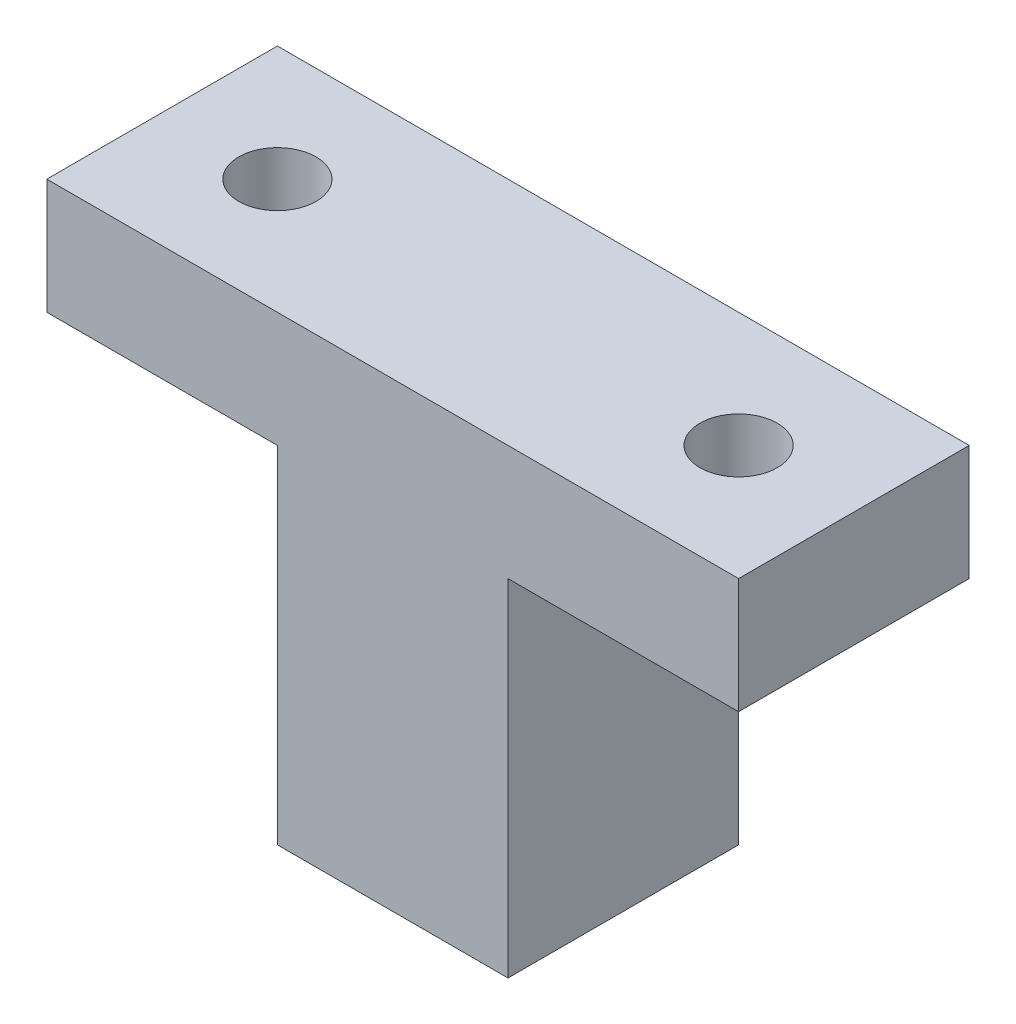
ISO-10303-21;
HEADER;
FILE_DESCRIPTION(('STEP AP214'),'2;1');
FILE_NAME('part.step','',(''),(''),'','','');
FILE_SCHEMA(('AUTOMOTIVE_DESIGN { 1 0 10303 214 1 1 1 1 }'));
ENDSEC;
DATA;
#1=APPLICATION_CONTEXT('core data for automotive mechanical design processes');
#2=APPLICATION_PROTOCOL_DEFINITION('international standard','automotive_design',2000,#1);
#3=PRODUCT_CONTEXT('',#1,'mechanical');
#4=PRODUCT('Part','Part','',(#3));
#5=PRODUCT_RELATED_PRODUCT_CATEGORY('part','',(#4));
#6=PRODUCT_DEFINITION_FORMATION('','',#4);
#7=PRODUCT_DEFINITION_CONTEXT('part definition',#1,'design');
#8=PRODUCT_DEFINITION('design','',#6,#7);
#9=PRODUCT_DEFINITION_SHAPE('','',#8);
#10=(LENGTH_UNIT() NAMED_UNIT(*) SI_UNIT(.MILLI.,.METRE.));
#11=(NAMED_UNIT(*) PLANE_ANGLE_UNIT() SI_UNIT($,.RADIAN.));
#12=(NAMED_UNIT(*) SI_UNIT($,.STERADIAN.) SOLID_ANGLE_UNIT());
#13=UNCERTAINTY_MEASURE_WITH_UNIT(LENGTH_MEASURE(1.E-05),#10,'distance_accuracy_value','');
#14=(GEOMETRIC_REPRESENTATION_CONTEXT(3) GLOBAL_UNCERTAINTY_ASSIGNED_CONTEXT((#13)) GLOBAL_UNIT_ASSIGNED_CONTEXT((#10,
#11,#12)) REPRESENTATION_CONTEXT('',''));
#15=CARTESIAN_POINT('',(0.,0.,0.));
#16=DIRECTION('',(0.,0.,1.));
#17=DIRECTION('',(1.,0.,0.));
#18=AXIS2_PLACEMENT_3D('',#15,#16,#17);
#19=CARTESIAN_POINT('',(-15.,-5.,10.));
#20=DIRECTION('',(1.,0.,0.));
#21=DIRECTION('',(0.,0.,-1.));
#22=AXIS2_PLACEMENT_3D('',#19,#20,#21);
#23=PLANE('',#22);
#24=DIRECTION('',(0.,-1.,0.));
#25=VECTOR('',#24,1.);
#26=CARTESIAN_POINT('',(-15.,-5.,0.));
#27=LINE('',#26,#25);
#28=CARTESIAN_POINT('',(-15.,0.,0.));
#29=VERTEX_POINT('',#28);
#30=CARTESIAN_POINT('',(-15.,-5.,0.));
#31=VERTEX_POINT('',#30);
#32=EDGE_CURVE('E133',#29,#31,#27,.T.);
#33=ORIENTED_EDGE('',*,*,#32,.T.);
#34=DIRECTION('',(0.,0.,-1.));
#35=VECTOR('',#34,1.);
#36=CARTESIAN_POINT('',(-15.,-5.,10.));
#37=LINE('',#36,#35);
#38=CARTESIAN_POINT('',(-15.,-5.,10.));
#39=VERTEX_POINT('',#38);
#40=EDGE_CURVE('E11',#39,#31,#37,.T.);
#41=ORIENTED_EDGE('',*,*,#40,.F.);
#42=DIRECTION('',(0.,-1.,0.));
#43=VECTOR('',#42,1.);
#44=CARTESIAN_POINT('',(-15.,-5.,10.));
#45=LINE('',#44,#43);
#46=CARTESIAN_POINT('',(-15.,0.,10.));
#47=VERTEX_POINT('',#46);
#48=EDGE_CURVE('E148',#47,#39,#45,.T.);
#49=ORIENTED_EDGE('',*,*,#48,.F.);
#50=DIRECTION('',(0.,0.,-1.));
#51=VECTOR('',#50,1.);
#52=CARTESIAN_POINT('',(-15.,0.,10.));
#53=LINE('',#52,#51);
#54=EDGE_CURVE('E129',#47,#29,#53,.T.);
#55=ORIENTED_EDGE('',*,*,#54,.T.);
#56=EDGE_LOOP('',(#33,#41,#49,#55));
#57=FACE_BOUND('',#56,.T.);
#58=ADVANCED_FACE('F37',(#57),#23,.F.);
#59=CARTESIAN_POINT('',(-5.,-5.,10.));
#60=DIRECTION('',(0.,1.,0.));
#61=DIRECTION('',(-1.,0.,0.));
#62=AXIS2_PLACEMENT_3D('',#59,#60,#61);
#63=PLANE('',#62);
#64=CARTESIAN_POINT('',(-10.,-5.,5.));
#65=DIRECTION('',(0.,1.,0.));
#66=DIRECTION('',(-1.,0.,0.));
#67=AXIS2_PLACEMENT_3D('',#64,#65,#66);
#68=CIRCLE('',#67,1.67499114648944);
#69=CARTESIAN_POINT('',(-8.32500885351056,-5.,5.));
#70=VERTEX_POINT('',#69);
#71=EDGE_CURVE('E137',#70,#70,#68,.T.);
#72=ORIENTED_EDGE('',*,*,#71,.T.);
#73=EDGE_LOOP('',(#72));
#74=FACE_BOUND('',#73,.T.);
#75=DIRECTION('',(1.,0.,0.));
#76=VECTOR('',#75,1.);
#77=CARTESIAN_POINT('',(-5.,-5.,0.));
#78=LINE('',#77,#76);
#79=CARTESIAN_POINT('',(-5.,-5.,0.));
#80=VERTEX_POINT('',#79);
#81=EDGE_CURVE('E136',#31,#80,#78,.T.);
#82=ORIENTED_EDGE('',*,*,#81,.T.);
#83=DIRECTION('',(0.,0.,-1.));
#84=VECTOR('',#83,1.);
#85=CARTESIAN_POINT('',(-5.,-5.,10.));
#86=LINE('',#85,#84);
#87=CARTESIAN_POINT('',(-5.,-5.,10.));
#88=VERTEX_POINT('',#87);
#89=EDGE_CURVE('E45',#88,#80,#86,.T.);
#90=ORIENTED_EDGE('',*,*,#89,.F.);
#91=DIRECTION('',(1.,0.,0.));
#92=VECTOR('',#91,1.);
#93=CARTESIAN_POINT('',(-5.,-5.,10.));
#94=LINE('',#93,#92);
#95=EDGE_CURVE('E96',#39,#88,#94,.T.);
#96=ORIENTED_EDGE('',*,*,#95,.F.);
#97=ORIENTED_EDGE('',*,*,#40,.T.);
#98=EDGE_LOOP('',(#82,#90,#96,#97));
#99=FACE_BOUND('',#98,.T.);
#100=ADVANCED_FACE('F203',(#74,#99),#63,.F.);
#101=CARTESIAN_POINT('',(-5.,-20.,10.));
#102=DIRECTION('',(1.,0.,0.));
#103=DIRECTION('',(0.,1.,0.));
#104=AXIS2_PLACEMENT_3D('',#101,#102,#103);
#105=PLANE('',#104);
#106=DIRECTION('',(0.,-1.,0.));
#107=VECTOR('',#106,1.);
#108=CARTESIAN_POINT('',(-5.,-20.,0.));
#109=LINE('',#108,#107);
#110=CARTESIAN_POINT('',(-5.,-20.,0.));
#111=VERTEX_POINT('',#110);
#112=EDGE_CURVE('E139',#80,#111,#109,.T.);
#113=ORIENTED_EDGE('',*,*,#112,.T.);
#114=DIRECTION('',(0.,0.,-1.));
#115=VECTOR('',#114,1.);
#116=CARTESIAN_POINT('',(-5.,-20.,10.));
#117=LINE('',#116,#115);
#118=CARTESIAN_POINT('',(-5.,-20.,10.));
#119=VERTEX_POINT('',#118);
#120=EDGE_CURVE('E155',#119,#111,#117,.T.);
#121=ORIENTED_EDGE('',*,*,#120,.F.);
#122=DIRECTION('',(0.,-1.,0.));
#123=VECTOR('',#122,1.);
#124=CARTESIAN_POINT('',(-5.,-20.,10.));
#125=LINE('',#124,#123);
#126=EDGE_CURVE('E163',#88,#119,#125,.T.);
#127=ORIENTED_EDGE('',*,*,#126,.F.);
#128=ORIENTED_EDGE('',*,*,#89,.T.);
#129=EDGE_LOOP('',(#113,#121,#127,#128));
#130=FACE_BOUND('',#129,.T.);
#131=ADVANCED_FACE('F161',(#130),#105,.F.);
#132=CARTESIAN_POINT('',(5.,-20.,10.));
#133=DIRECTION('',(0.,1.,0.));
#134=DIRECTION('',(0.,0.,1.));
#135=AXIS2_PLACEMENT_3D('',#132,#133,#134);
#136=PLANE('',#135);
#137=DIRECTION('',(1.,0.,0.));
#138=VECTOR('',#137,1.);
#139=CARTESIAN_POINT('',(5.,-20.,0.));
#140=LINE('',#139,#138);
#141=CARTESIAN_POINT('',(5.,-20.,0.));
#142=VERTEX_POINT('',#141);
#143=EDGE_CURVE('E141',#111,#142,#140,.T.);
#144=ORIENTED_EDGE('',*,*,#143,.T.);
#145=DIRECTION('',(0.,0.,-1.));
#146=VECTOR('',#145,1.);
#147=CARTESIAN_POINT('',(5.,-20.,10.));
#148=LINE('',#147,#146);
#149=CARTESIAN_POINT('',(5.,-20.,10.));
#150=VERTEX_POINT('',#149);
#151=EDGE_CURVE('E152',#150,#142,#148,.T.);
#152=ORIENTED_EDGE('',*,*,#151,.F.);
#153=DIRECTION('',(1.,0.,0.));
#154=VECTOR('',#153,1.);
#155=CARTESIAN_POINT('',(5.,-20.,10.));
#156=LINE('',#155,#154);
#157=EDGE_CURVE('E175',#119,#150,#156,.T.);
#158=ORIENTED_EDGE('',*,*,#157,.F.);
#159=ORIENTED_EDGE('',*,*,#120,.T.);
#160=EDGE_LOOP('',(#144,#152,#158,#159));
#161=FACE_BOUND('',#160,.T.);
#162=ADVANCED_FACE('F171',(#161),#136,.F.);
#163=CARTESIAN_POINT('',(5.,-20.,10.));
#164=DIRECTION('',(-1.,0.,0.));
#165=DIRECTION('',(0.,-1.,0.));
#166=AXIS2_PLACEMENT_3D('',#163,#164,#165);
#167=PLANE('',#166);
#168=DIRECTION('',(0.,1.,0.));
#169=VECTOR('',#168,1.);
#170=CARTESIAN_POINT('',(5.,-20.,0.));
#171=LINE('',#170,#169);
#172=CARTESIAN_POINT('',(5.,-5.,0.));
#173=VERTEX_POINT('',#172);
#174=EDGE_CURVE('E143',#142,#173,#171,.T.);
#175=ORIENTED_EDGE('',*,*,#174,.T.);
#176=DIRECTION('',(0.,0.,-1.));
#177=VECTOR('',#176,1.);
#178=CARTESIAN_POINT('',(5.,-5.,10.));
#179=LINE('',#178,#177);
#180=CARTESIAN_POINT('',(5.,-5.,10.));
#181=VERTEX_POINT('',#180);
#182=EDGE_CURVE('E124',#181,#173,#179,.T.);
#183=ORIENTED_EDGE('',*,*,#182,.F.);
#184=DIRECTION('',(0.,1.,0.));
#185=VECTOR('',#184,1.);
#186=CARTESIAN_POINT('',(5.,-20.,10.));
#187=LINE('',#186,#185);
#188=EDGE_CURVE('E115',#150,#181,#187,.T.);
#189=ORIENTED_EDGE('',*,*,#188,.F.);
#190=ORIENTED_EDGE('',*,*,#151,.T.);
#191=EDGE_LOOP('',(#175,#183,#189,#190));
#192=FACE_BOUND('',#191,.T.);
#193=ADVANCED_FACE('F174',(#192),#167,.F.);
#194=CARTESIAN_POINT('',(5.,-5.,10.));
#195=DIRECTION('',(0.,1.,0.));
#196=DIRECTION('',(-1.,0.,0.));
#197=AXIS2_PLACEMENT_3D('',#194,#195,#196);
#198=PLANE('',#197);
#199=CARTESIAN_POINT('',(10.,-5.,5.));
#200=DIRECTION('',(0.,1.,0.));
#201=DIRECTION('',(-1.,0.,0.));
#202=AXIS2_PLACEMENT_3D('',#199,#200,#201);
#203=CIRCLE('',#202,1.67499114648944);
#204=CARTESIAN_POINT('',(11.6749911464894,-5.,5.));
#205=VERTEX_POINT('',#204);
#206=EDGE_CURVE('E183',#205,#205,#203,.T.);
#207=ORIENTED_EDGE('',*,*,#206,.T.);
#208=EDGE_LOOP('',(#207));
#209=FACE_BOUND('',#208,.T.);
#210=DIRECTION('',(1.,0.,0.));
#211=VECTOR('',#210,1.);
#212=CARTESIAN_POINT('',(5.,-5.,0.));
#213=LINE('',#212,#211);
#214=CARTESIAN_POINT('',(15.,-5.,0.));
#215=VERTEX_POINT('',#214);
#216=EDGE_CURVE('E123',#173,#215,#213,.T.);
#217=ORIENTED_EDGE('',*,*,#216,.T.);
#218=DIRECTION('',(0.,0.,-1.));
#219=VECTOR('',#218,1.);
#220=CARTESIAN_POINT('',(15.,-5.,10.));
#221=LINE('',#220,#219);
#222=CARTESIAN_POINT('',(15.,-5.,10.));
#223=VERTEX_POINT('',#222);
#224=EDGE_CURVE('E120',#223,#215,#221,.T.);
#225=ORIENTED_EDGE('',*,*,#224,.F.);
#226=DIRECTION('',(1.,0.,0.));
#227=VECTOR('',#226,1.);
#228=CARTESIAN_POINT('',(5.,-5.,10.));
#229=LINE('',#228,#227);
#230=EDGE_CURVE('E109',#181,#223,#229,.T.);
#231=ORIENTED_EDGE('',*,*,#230,.F.);
#232=ORIENTED_EDGE('',*,*,#182,.T.);
#233=EDGE_LOOP('',(#217,#225,#231,#232));
#234=FACE_BOUND('',#233,.T.);
#235=ADVANCED_FACE('F121',(#209,#234),#198,.F.);
#236=CARTESIAN_POINT('',(15.,-5.,10.));
#237=DIRECTION('',(-1.,0.,0.));
#238=DIRECTION('',(0.,0.,1.));
#239=AXIS2_PLACEMENT_3D('',#236,#237,#238);
#240=PLANE('',#239);
#241=DIRECTION('',(0.,1.,0.));
#242=VECTOR('',#241,1.);
#243=CARTESIAN_POINT('',(15.,-5.,0.));
#244=LINE('',#243,#242);
#245=CARTESIAN_POINT('',(15.,0.,0.));
#246=VERTEX_POINT('',#245);
#247=EDGE_CURVE('E82',#215,#246,#244,.T.);
#248=ORIENTED_EDGE('',*,*,#247,.T.);
#249=DIRECTION('',(0.,0.,-1.));
#250=VECTOR('',#249,1.);
#251=CARTESIAN_POINT('',(15.,0.,10.));
#252=LINE('',#251,#250);
#253=CARTESIAN_POINT('',(15.,0.,10.));
#254=VERTEX_POINT('',#253);
#255=EDGE_CURVE('E125',#254,#246,#252,.T.);
#256=ORIENTED_EDGE('',*,*,#255,.F.);
#257=DIRECTION('',(0.,1.,0.));
#258=VECTOR('',#257,1.);
#259=CARTESIAN_POINT('',(15.,-5.,10.));
#260=LINE('',#259,#258);
#261=EDGE_CURVE('E113',#223,#254,#260,.T.);
#262=ORIENTED_EDGE('',*,*,#261,.F.);
#263=ORIENTED_EDGE('',*,*,#224,.T.);
#264=EDGE_LOOP('',(#248,#256,#262,#263));
#265=FACE_BOUND('',#264,.T.);
#266=ADVANCED_FACE('F127',(#265),#240,.F.);
#267=CARTESIAN_POINT('',(-15.,0.,10.));
#268=DIRECTION('',(0.,-1.,0.));
#269=DIRECTION('',(0.,0.,-1.));
#270=AXIS2_PLACEMENT_3D('',#267,#268,#269);
#271=PLANE('',#270);
#272=CARTESIAN_POINT('',(-10.,0.,5.));
#273=DIRECTION('',(0.,-1.,0.));
#274=DIRECTION('',(1.,0.,0.));
#275=AXIS2_PLACEMENT_3D('',#272,#273,#274);
#276=CIRCLE('',#275,1.67499114648944);
#277=CARTESIAN_POINT('',(-8.32500885351056,0.,5.));
#278=VERTEX_POINT('',#277);
#279=EDGE_CURVE('E186',#278,#278,#276,.T.);
#280=ORIENTED_EDGE('',*,*,#279,.T.);
#281=EDGE_LOOP('',(#280));
#282=FACE_BOUND('',#281,.T.);
#283=CARTESIAN_POINT('',(10.,0.,5.));
#284=DIRECTION('',(0.,-1.,0.));
#285=DIRECTION('',(-1.,0.,0.));
#286=AXIS2_PLACEMENT_3D('',#283,#284,#285);
#287=CIRCLE('',#286,1.67499114648944);
#288=CARTESIAN_POINT('',(11.6749911464894,0.,5.));
#289=VERTEX_POINT('',#288);
#290=EDGE_CURVE('E187',#289,#289,#287,.T.);
#291=ORIENTED_EDGE('',*,*,#290,.T.);
#292=EDGE_LOOP('',(#291));
#293=FACE_BOUND('',#292,.T.);
#294=DIRECTION('',(-1.,0.,0.));
#295=VECTOR('',#294,1.);
#296=CARTESIAN_POINT('',(-15.,0.,0.));
#297=LINE('',#296,#295);
#298=EDGE_CURVE('E88',#246,#29,#297,.T.);
#299=ORIENTED_EDGE('',*,*,#298,.T.);
#300=ORIENTED_EDGE('',*,*,#54,.F.);
#301=DIRECTION('',(-1.,0.,0.));
#302=VECTOR('',#301,1.);
#303=CARTESIAN_POINT('',(-15.,0.,10.));
#304=LINE('',#303,#302);
#305=EDGE_CURVE('E53',#254,#47,#304,.T.);
#306=ORIENTED_EDGE('',*,*,#305,.F.);
#307=ORIENTED_EDGE('',*,*,#255,.T.);
#308=EDGE_LOOP('',(#299,#300,#306,#307));
#309=FACE_BOUND('',#308,.T.);
#310=ADVANCED_FACE('F193',(#282,#293,#309),#271,.F.);
#311=CARTESIAN_POINT('',(0.,0.,10.));
#312=DIRECTION('',(0.,0.,-1.));
#313=DIRECTION('',(-1.,0.,0.));
#314=AXIS2_PLACEMENT_3D('',#311,#312,#313);
#315=PLANE('',#314);
#316=ORIENTED_EDGE('',*,*,#48,.T.);
#317=ORIENTED_EDGE('',*,*,#95,.T.);
#318=ORIENTED_EDGE('',*,*,#126,.T.);
#319=ORIENTED_EDGE('',*,*,#157,.T.);
#320=ORIENTED_EDGE('',*,*,#188,.T.);
#321=ORIENTED_EDGE('',*,*,#230,.T.);
#322=ORIENTED_EDGE('',*,*,#261,.T.);
#323=ORIENTED_EDGE('',*,*,#305,.T.);
#324=EDGE_LOOP('',(#316,#317,#318,#319,#320,#321,#322,#323));
#325=FACE_BOUND('',#324,.T.);
#326=ADVANCED_FACE('F111',(#325),#315,.F.);
#327=CARTESIAN_POINT('',(0.,0.,0.));
#328=DIRECTION('',(0.,0.,-1.));
#329=DIRECTION('',(-1.,0.,0.));
#330=AXIS2_PLACEMENT_3D('',#327,#328,#329);
#331=PLANE('',#330);
#332=ORIENTED_EDGE('',*,*,#32,.F.);
#333=ORIENTED_EDGE('',*,*,#298,.F.);
#334=ORIENTED_EDGE('',*,*,#247,.F.);
#335=ORIENTED_EDGE('',*,*,#216,.F.);
#336=ORIENTED_EDGE('',*,*,#174,.F.);
#337=ORIENTED_EDGE('',*,*,#143,.F.);
#338=ORIENTED_EDGE('',*,*,#112,.F.);
#339=ORIENTED_EDGE('',*,*,#81,.F.);
#340=EDGE_LOOP('',(#332,#333,#334,#335,#336,#337,#338,#339));
#341=FACE_BOUND('',#340,.T.);
#342=ADVANCED_FACE('F167',(#341),#331,.T.);
#343=CARTESIAN_POINT('',(10.,0.,5.));
#344=DIRECTION('',(0.,-1.,0.));
#345=DIRECTION('',(1.,0.,0.));
#346=AXIS2_PLACEMENT_3D('',#343,#344,#345);
#347=CYLINDRICAL_SURFACE('',#346,1.67499114648944);
#348=CARTESIAN_POINT('',(11.6749911464894,0.,5.));
#349=CARTESIAN_POINT('',(11.6749911464894,-0.0520833333333286,5.));
#350=CARTESIAN_POINT('',(11.6749911464894,-0.104166666666662,5.));
#351=CARTESIAN_POINT('',(11.6749911464894,-0.208333333333329,5.));
#352=CARTESIAN_POINT('',(11.6749911464894,-0.260416666666662,5.));
#353=CARTESIAN_POINT('',(11.6749911464894,-0.364583333333329,5.));
#354=CARTESIAN_POINT('',(11.6749911464894,-0.416666666666662,5.));
#355=CARTESIAN_POINT('',(11.6749911464894,-0.520833333333329,5.));
#356=CARTESIAN_POINT('',(11.6749911464894,-0.572916666666662,5.));
#357=CARTESIAN_POINT('',(11.6749911464894,-0.677083333333329,5.));
#358=CARTESIAN_POINT('',(11.6749911464894,-0.729166666666662,5.));
#359=CARTESIAN_POINT('',(11.6749911464894,-0.833333333333329,5.));
#360=CARTESIAN_POINT('',(11.6749911464894,-0.885416666666662,5.));
#361=CARTESIAN_POINT('',(11.6749911464894,-0.989583333333329,5.));
#362=CARTESIAN_POINT('',(11.6749911464894,-1.04166666666666,5.));
#363=CARTESIAN_POINT('',(11.6749911464894,-1.14583333333333,5.));
#364=CARTESIAN_POINT('',(11.6749911464894,-1.19791666666666,5.));
#365=CARTESIAN_POINT('',(11.6749911464894,-1.30208333333333,5.));
#366=CARTESIAN_POINT('',(11.6749911464894,-1.35416666666666,5.));
#367=CARTESIAN_POINT('',(11.6749911464894,-1.45833333333333,5.));
#368=CARTESIAN_POINT('',(11.6749911464894,-1.51041666666666,5.));
#369=CARTESIAN_POINT('',(11.6749911464894,-1.61458333333333,5.));
#370=CARTESIAN_POINT('',(11.6749911464894,-1.66666666666666,5.));
#371=CARTESIAN_POINT('',(11.6749911464894,-1.77083333333333,5.));
#372=CARTESIAN_POINT('',(11.6749911464894,-1.82291666666666,5.));
#373=CARTESIAN_POINT('',(11.6749911464894,-1.92708333333333,5.));
#374=CARTESIAN_POINT('',(11.6749911464894,-1.97916666666666,5.));
#375=CARTESIAN_POINT('',(11.6749911464894,-2.08333333333333,5.));
#376=CARTESIAN_POINT('',(11.6749911464894,-2.13541666666666,5.));
#377=CARTESIAN_POINT('',(11.6749911464894,-2.23958333333333,5.));
#378=CARTESIAN_POINT('',(11.6749911464894,-2.29166666666666,5.));
#379=CARTESIAN_POINT('',(11.6749911464894,-2.39583333333333,5.));
#380=CARTESIAN_POINT('',(11.6749911464894,-2.44791666666666,5.));
#381=CARTESIAN_POINT('',(11.6749911464894,-2.55208333333333,5.));
#382=CARTESIAN_POINT('',(11.6749911464894,-2.60416666666666,5.));
#383=CARTESIAN_POINT('',(11.6749911464894,-2.70833333333333,5.));
#384=CARTESIAN_POINT('',(11.6749911464894,-2.76041666666666,5.));
#385=CARTESIAN_POINT('',(11.6749911464894,-2.86458333333333,5.));
#386=CARTESIAN_POINT('',(11.6749911464894,-2.91666666666666,5.));
#387=CARTESIAN_POINT('',(11.6749911464894,-3.02083333333333,5.));
#388=CARTESIAN_POINT('',(11.6749911464894,-3.07291666666666,5.));
#389=CARTESIAN_POINT('',(11.6749911464894,-3.17708333333333,5.));
#390=CARTESIAN_POINT('',(11.6749911464894,-3.22916666666666,5.));
#391=CARTESIAN_POINT('',(11.6749911464894,-3.33333333333333,5.));
#392=CARTESIAN_POINT('',(11.6749911464894,-3.38541666666666,5.));
#393=CARTESIAN_POINT('',(11.6749911464894,-3.48958333333333,5.));
#394=CARTESIAN_POINT('',(11.6749911464894,-3.54166666666666,5.));
#395=CARTESIAN_POINT('',(11.6749911464894,-3.64583333333333,5.));
#396=CARTESIAN_POINT('',(11.6749911464894,-3.69791666666666,5.));
#397=CARTESIAN_POINT('',(11.6749911464894,-3.80208333333333,5.));
#398=CARTESIAN_POINT('',(11.6749911464894,-3.85416666666666,5.));
#399=CARTESIAN_POINT('',(11.6749911464894,-3.95833333333333,5.));
#400=CARTESIAN_POINT('',(11.6749911464894,-4.01041666666666,5.));
#401=CARTESIAN_POINT('',(11.6749911464894,-4.11458333333333,5.));
#402=CARTESIAN_POINT('',(11.6749911464894,-4.16666666666666,5.));
#403=CARTESIAN_POINT('',(11.6749911464894,-4.27083333333333,5.));
#404=CARTESIAN_POINT('',(11.6749911464894,-4.32291666666666,5.));
#405=CARTESIAN_POINT('',(11.6749911464894,-4.42708333333333,5.));
#406=CARTESIAN_POINT('',(11.6749911464894,-4.47916666666666,5.));
#407=CARTESIAN_POINT('',(11.6749911464894,-4.58333333333333,5.));
#408=CARTESIAN_POINT('',(11.6749911464894,-4.63541666666666,5.));
#409=CARTESIAN_POINT('',(11.6749911464894,-4.73958333333333,5.));
#410=CARTESIAN_POINT('',(11.6749911464894,-4.79166666666666,5.));
#411=CARTESIAN_POINT('',(11.6749911464894,-4.89583333333333,5.));
#412=CARTESIAN_POINT('',(11.6749911464894,-4.94791666666666,5.));
#413=CARTESIAN_POINT('',(11.6749911464894,-5.,5.));
#414=B_SPLINE_CURVE_WITH_KNOTS('',3,(#348,#349,#350,#351,#352,#353,#354,#355,#356,#357,#358,
#359,#360,#361,#362,#363,#364,#365,#366,#367,#368,#369,#370,#371,#372,#373,#374,#375,#376,#377,
#378,#379,#380,#381,#382,#383,#384,#385,#386,#387,#388,#389,#390,#391,#392,#393,#394,#395,#396,
#397,#398,#399,#400,#401,#402,#403,#404,#405,#406,#407,#408,#409,#410,#411,#412,#413),
.UNSPECIFIED.,.F.,.F.,(4,2,2,2,2,2,2,2,2,2,2,2,2,2,2,2,2,2,2,2,2,2,2,2,2,2,2,2,2,2,2,2,4),(0.,
0.15625,0.3125,0.46875,0.625,0.78125,0.9375,1.09375,1.25,1.40625,1.5625,1.71875,1.875,2.03125,
2.1875,2.34375,2.5,2.65625,2.8125,2.96875,3.125,3.28125,3.4375,3.59375,3.75,3.90625,4.0625,
4.21875,4.375,4.53125,4.6875,4.84375,5.),.UNSPECIFIED.);
#415=EDGE_CURVE('BSEAM199',#289,#205,#414,.T.);
#416=ORIENTED_EDGE('',*,*,#290,.F.);
#417=ORIENTED_EDGE('',*,*,#206,.F.);
#418=ORIENTED_EDGE('',*,*,#415,.T.);
#419=ORIENTED_EDGE('',*,*,#415,.F.);
#420=EDGE_LOOP('',(#416,#418,#417,#419));
#421=FACE_BOUND('',#420,.T.);
#422=ADVANCED_FACE('F199',(#421),#347,.F.);
#423=CARTESIAN_POINT('',(-10.,0.,5.));
#424=DIRECTION('',(0.,-1.,0.));
#425=DIRECTION('',(1.,0.,0.));
#426=AXIS2_PLACEMENT_3D('',#423,#424,#425);
#427=CYLINDRICAL_SURFACE('',#426,1.67499114648944);
#428=CARTESIAN_POINT('',(-8.32500885351056,0.,5.));
#429=CARTESIAN_POINT('',(-8.32500885351056,-0.0520833333333322,5.));
#430=CARTESIAN_POINT('',(-8.32500885351056,-0.104166666666665,5.));
#431=CARTESIAN_POINT('',(-8.32500885351056,-0.208333333333332,5.));
#432=CARTESIAN_POINT('',(-8.32500885351056,-0.260416666666666,5.));
#433=CARTESIAN_POINT('',(-8.32500885351056,-0.364583333333332,5.));
#434=CARTESIAN_POINT('',(-8.32500885351056,-0.416666666666666,5.));
#435=CARTESIAN_POINT('',(-8.32500885351056,-0.520833333333332,5.));
#436=CARTESIAN_POINT('',(-8.32500885351056,-0.572916666666666,5.));
#437=CARTESIAN_POINT('',(-8.32500885351056,-0.677083333333332,5.));
#438=CARTESIAN_POINT('',(-8.32500885351056,-0.729166666666666,5.));
#439=CARTESIAN_POINT('',(-8.32500885351056,-0.833333333333332,5.));
#440=CARTESIAN_POINT('',(-8.32500885351056,-0.885416666666666,5.));
#441=CARTESIAN_POINT('',(-8.32500885351056,-0.989583333333332,5.));
#442=CARTESIAN_POINT('',(-8.32500885351056,-1.04166666666667,5.));
#443=CARTESIAN_POINT('',(-8.32500885351056,-1.14583333333333,5.));
#444=CARTESIAN_POINT('',(-8.32500885351056,-1.19791666666667,5.));
#445=CARTESIAN_POINT('',(-8.32500885351056,-1.30208333333333,5.));
#446=CARTESIAN_POINT('',(-8.32500885351056,-1.35416666666667,5.));
#447=CARTESIAN_POINT('',(-8.32500885351056,-1.45833333333333,5.));
#448=CARTESIAN_POINT('',(-8.32500885351056,-1.51041666666667,5.));
#449=CARTESIAN_POINT('',(-8.32500885351056,-1.61458333333333,5.));
#450=CARTESIAN_POINT('',(-8.32500885351056,-1.66666666666667,5.));
#451=CARTESIAN_POINT('',(-8.32500885351056,-1.77083333333333,5.));
#452=CARTESIAN_POINT('',(-8.32500885351056,-1.82291666666667,5.));
#453=CARTESIAN_POINT('',(-8.32500885351056,-1.92708333333333,5.));
#454=CARTESIAN_POINT('',(-8.32500885351056,-1.97916666666667,5.));
#455=CARTESIAN_POINT('',(-8.32500885351056,-2.08333333333333,5.));
#456=CARTESIAN_POINT('',(-8.32500885351056,-2.13541666666667,5.));
#457=CARTESIAN_POINT('',(-8.32500885351056,-2.23958333333333,5.));
#458=CARTESIAN_POINT('',(-8.32500885351056,-2.29166666666667,5.));
#459=CARTESIAN_POINT('',(-8.32500885351056,-2.39583333333333,5.));
#460=CARTESIAN_POINT('',(-8.32500885351056,-2.44791666666667,5.));
#461=CARTESIAN_POINT('',(-8.32500885351056,-2.55208333333333,5.));
#462=CARTESIAN_POINT('',(-8.32500885351056,-2.60416666666667,5.));
#463=CARTESIAN_POINT('',(-8.32500885351056,-2.70833333333333,5.));
#464=CARTESIAN_POINT('',(-8.32500885351056,-2.76041666666667,5.));
#465=CARTESIAN_POINT('',(-8.32500885351056,-2.86458333333333,5.));
#466=CARTESIAN_POINT('',(-8.32500885351056,-2.91666666666667,5.));
#467=CARTESIAN_POINT('',(-8.32500885351056,-3.02083333333333,5.));
#468=CARTESIAN_POINT('',(-8.32500885351056,-3.07291666666667,5.));
#469=CARTESIAN_POINT('',(-8.32500885351056,-3.17708333333333,5.));
#470=CARTESIAN_POINT('',(-8.32500885351056,-3.22916666666667,5.));
#471=CARTESIAN_POINT('',(-8.32500885351056,-3.33333333333333,5.));
#472=CARTESIAN_POINT('',(-8.32500885351056,-3.38541666666667,5.));
#473=CARTESIAN_POINT('',(-8.32500885351056,-3.48958333333333,5.));
#474=CARTESIAN_POINT('',(-8.32500885351056,-3.54166666666667,5.));
#475=CARTESIAN_POINT('',(-8.32500885351056,-3.64583333333333,5.));
#476=CARTESIAN_POINT('',(-8.32500885351056,-3.69791666666667,5.));
#477=CARTESIAN_POINT('',(-8.32500885351056,-3.80208333333333,5.));
#478=CARTESIAN_POINT('',(-8.32500885351056,-3.85416666666667,5.));
#479=CARTESIAN_POINT('',(-8.32500885351056,-3.95833333333333,5.));
#480=CARTESIAN_POINT('',(-8.32500885351056,-4.01041666666667,5.));
#481=CARTESIAN_POINT('',(-8.32500885351056,-4.11458333333333,5.));
#482=CARTESIAN_POINT('',(-8.32500885351056,-4.16666666666667,5.));
#483=CARTESIAN_POINT('',(-8.32500885351056,-4.27083333333333,5.));
#484=CARTESIAN_POINT('',(-8.32500885351056,-4.32291666666667,5.));
#485=CARTESIAN_POINT('',(-8.32500885351056,-4.42708333333333,5.));
#486=CARTESIAN_POINT('',(-8.32500885351056,-4.47916666666667,5.));
#487=CARTESIAN_POINT('',(-8.32500885351056,-4.58333333333333,5.));
#488=CARTESIAN_POINT('',(-8.32500885351056,-4.63541666666667,5.));
#489=CARTESIAN_POINT('',(-8.32500885351056,-4.73958333333333,5.));
#490=CARTESIAN_POINT('',(-8.32500885351056,-4.79166666666667,5.));
#491=CARTESIAN_POINT('',(-8.32500885351056,-4.89583333333333,5.));
#492=CARTESIAN_POINT('',(-8.32500885351056,-4.94791666666667,5.));
#493=CARTESIAN_POINT('',(-8.32500885351056,-5.,5.));
#494=B_SPLINE_CURVE_WITH_KNOTS('',3,(#428,#429,#430,#431,#432,#433,#434,#435,#436,#437,#438,
#439,#440,#441,#442,#443,#444,#445,#446,#447,#448,#449,#450,#451,#452,#453,#454,#455,#456,#457,
#458,#459,#460,#461,#462,#463,#464,#465,#466,#467,#468,#469,#470,#471,#472,#473,#474,#475,#476,
#477,#478,#479,#480,#481,#482,#483,#484,#485,#486,#487,#488,#489,#490,#491,#492,#493),
.UNSPECIFIED.,.F.,.F.,(4,2,2,2,2,2,2,2,2,2,2,2,2,2,2,2,2,2,2,2,2,2,2,2,2,2,2,2,2,2,2,2,4),(0.,
0.15625,0.3125,0.46875,0.625,0.78125,0.9375,1.09375,1.25,1.40625,1.5625,1.71875,1.875,2.03125,
2.1875,2.34375,2.5,2.65625,2.8125,2.96875,3.125,3.28125,3.4375,3.59375,3.75,3.90625,4.0625,
4.21875,4.375,4.53125,4.6875,4.84375,5.),.UNSPECIFIED.);
#495=EDGE_CURVE('BSEAM196',#278,#70,#494,.T.);
#496=ORIENTED_EDGE('',*,*,#279,.F.);
#497=ORIENTED_EDGE('',*,*,#71,.F.);
#498=ORIENTED_EDGE('',*,*,#495,.T.);
#499=ORIENTED_EDGE('',*,*,#495,.F.);
#500=EDGE_LOOP('',(#496,#498,#497,#499));
#501=FACE_BOUND('',#500,.T.);
#502=ADVANCED_FACE('F196',(#501),#427,.F.);
#503=CLOSED_SHELL('',(#58,#100,#131,#162,#193,#235,#266,#310,#326,#342,#422,#502));
#504=MANIFOLD_SOLID_BREP('B2',#503);
#505=ADVANCED_BREP_SHAPE_REPRESENTATION('',(#18,#504),#14);
#506=SHAPE_DEFINITION_REPRESENTATION(#9,#505);
ENDSEC;
END-ISO-10303-21;
